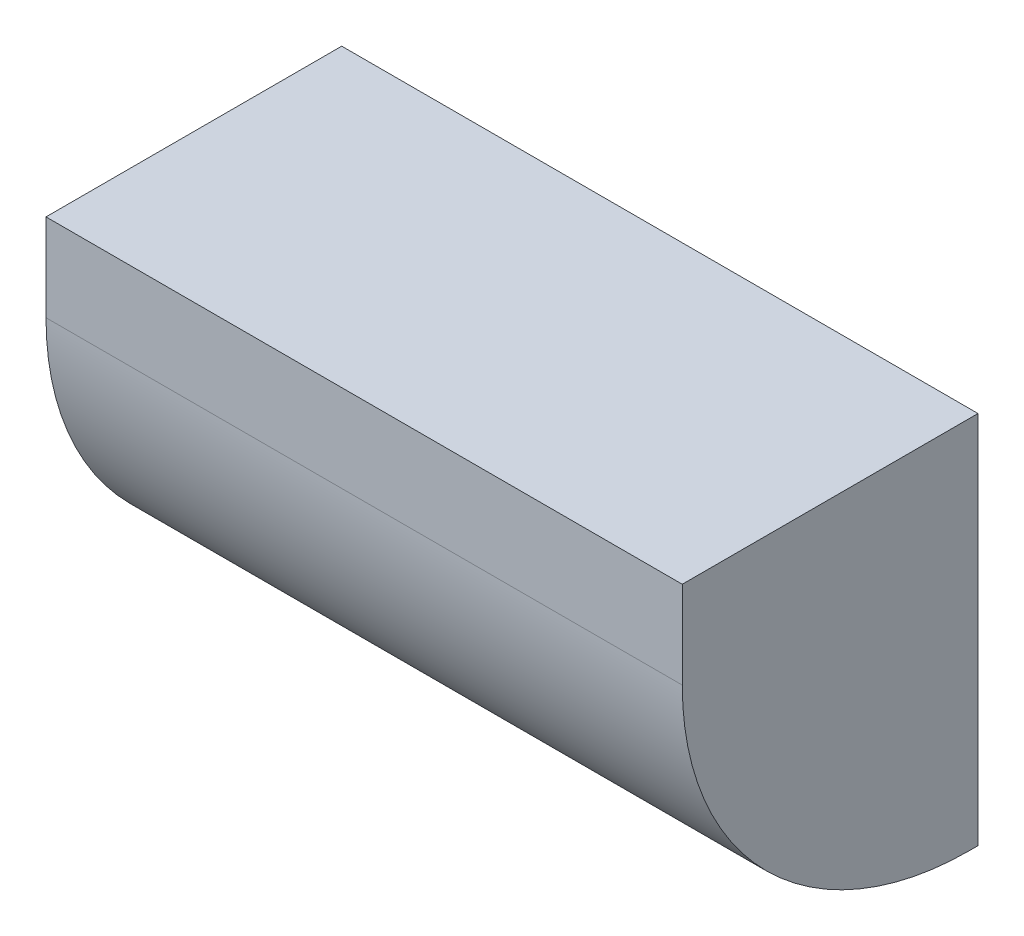
ISO-10303-21;
HEADER;
FILE_DESCRIPTION(('STEP AP214'),'2;1');
FILE_NAME('part.step','',(''),(''),'','','');
FILE_SCHEMA(('AUTOMOTIVE_DESIGN { 1 0 10303 214 1 1 1 1 }'));
ENDSEC;
DATA;
#1=APPLICATION_CONTEXT('core data for automotive mechanical design processes');
#2=APPLICATION_PROTOCOL_DEFINITION('international standard','automotive_design',2000,#1);
#3=PRODUCT_CONTEXT('',#1,'mechanical');
#4=PRODUCT('Part','Part','',(#3));
#5=PRODUCT_RELATED_PRODUCT_CATEGORY('part','',(#4));
#6=PRODUCT_DEFINITION_FORMATION('','',#4);
#7=PRODUCT_DEFINITION_CONTEXT('part definition',#1,'design');
#8=PRODUCT_DEFINITION('design','',#6,#7);
#9=PRODUCT_DEFINITION_SHAPE('','',#8);
#10=(LENGTH_UNIT() NAMED_UNIT(*) SI_UNIT(.MILLI.,.METRE.));
#11=(NAMED_UNIT(*) PLANE_ANGLE_UNIT() SI_UNIT($,.RADIAN.));
#12=(NAMED_UNIT(*) SI_UNIT($,.STERADIAN.) SOLID_ANGLE_UNIT());
#13=UNCERTAINTY_MEASURE_WITH_UNIT(LENGTH_MEASURE(1.E-05),#10,'distance_accuracy_value','');
#14=(GEOMETRIC_REPRESENTATION_CONTEXT(3) GLOBAL_UNCERTAINTY_ASSIGNED_CONTEXT((#13)) GLOBAL_UNIT_ASSIGNED_CONTEXT((#10,
#11,#12)) REPRESENTATION_CONTEXT('',''));
#15=CARTESIAN_POINT('',(0.,0.,0.));
#16=DIRECTION('',(0.,0.,1.));
#17=DIRECTION('',(1.,0.,0.));
#18=AXIS2_PLACEMENT_3D('',#15,#16,#17);
#19=CARTESIAN_POINT('',(0.,62.8959813156576,105.442125645559));
#20=DIRECTION('',(1.,0.,0.));
#21=DIRECTION('',(0.,0.,-1.));
#22=AXIS2_PLACEMENT_3D('',#19,#20,#21);
#23=CYLINDRICAL_SURFACE('',#22,23.);
#24=DIRECTION('',(-1.,0.,0.));
#25=VECTOR('',#24,1.);
#26=CARTESIAN_POINT('',(0.,39.8959813156576,105.442125645559));
#27=LINE('',#26,#25);
#28=CARTESIAN_POINT('',(280.,39.8959813156576,105.442125645559));
#29=VERTEX_POINT('',#28);
#30=CARTESIAN_POINT('',(229.,39.8959813156576,105.442125645559));
#31=VERTEX_POINT('',#30);
#32=EDGE_CURVE('E86',#29,#31,#27,.T.);
#33=ORIENTED_EDGE('',*,*,#32,.F.);
#34=CARTESIAN_POINT('',(280.,62.8959813156576,105.442125645559));
#35=DIRECTION('',(-1.,0.,0.));
#36=DIRECTION('',(0.,0.,1.));
#37=AXIS2_PLACEMENT_3D('',#34,#35,#36);
#38=CIRCLE('',#37,23.);
#39=CARTESIAN_POINT('',(280.,62.8959813156576,128.442125645559));
#40=VERTEX_POINT('',#39);
#41=EDGE_CURVE('E45',#40,#29,#38,.F.);
#42=ORIENTED_EDGE('',*,*,#41,.F.);
#43=DIRECTION('',(-1.,0.,0.));
#44=VECTOR('',#43,1.);
#45=CARTESIAN_POINT('',(0.,62.8959813156576,128.442125645559));
#46=LINE('',#45,#44);
#47=CARTESIAN_POINT('',(229.,62.8959813156576,128.442125645559));
#48=VERTEX_POINT('',#47);
#49=EDGE_CURVE('E115',#48,#40,#46,.F.);
#50=ORIENTED_EDGE('',*,*,#49,.F.);
#51=CARTESIAN_POINT('',(229.,62.8959813156576,105.442125645559));
#52=DIRECTION('',(1.,0.,0.));
#53=DIRECTION('',(0.,0.,-1.));
#54=AXIS2_PLACEMENT_3D('',#51,#52,#53);
#55=CIRCLE('',#54,23.);
#56=EDGE_CURVE('E11',#31,#48,#55,.F.);
#57=ORIENTED_EDGE('',*,*,#56,.F.);
#58=EDGE_LOOP('',(#33,#42,#50,#57));
#59=FACE_BOUND('',#58,.T.);
#60=ADVANCED_FACE('F38',(#59),#23,.T.);
#61=CARTESIAN_POINT('',(229.,-16.3431848396095,128.442125645559));
#62=DIRECTION('',(1.,0.,0.));
#63=DIRECTION('',(0.,0.,-1.));
#64=AXIS2_PLACEMENT_3D('',#61,#62,#63);
#65=PLANE('',#64);
#66=DIRECTION('',(0.,0.,-1.));
#67=VECTOR('',#66,1.);
#68=CARTESIAN_POINT('',(229.,39.8959813156576,128.442125645559));
#69=LINE('',#68,#67);
#70=CARTESIAN_POINT('',(229.,39.8959813156576,104.738880934344));
#71=VERTEX_POINT('',#70);
#72=EDGE_CURVE('E81',#31,#71,#69,.T.);
#73=ORIENTED_EDGE('',*,*,#72,.F.);
#74=ORIENTED_EDGE('',*,*,#56,.T.);
#75=DIRECTION('',(0.,1.,0.));
#76=VECTOR('',#75,1.);
#77=CARTESIAN_POINT('',(229.,-16.3431848396095,128.442125645559));
#78=LINE('',#77,#76);
#79=CARTESIAN_POINT('',(229.,69.8959813156576,128.442125645559));
#80=VERTEX_POINT('',#79);
#81=EDGE_CURVE('E106',#48,#80,#78,.T.);
#82=ORIENTED_EDGE('',*,*,#81,.T.);
#83=DIRECTION('',(0.,0.,-1.));
#84=VECTOR('',#83,1.);
#85=CARTESIAN_POINT('',(229.,69.8959813156576,128.442125645559));
#86=LINE('',#85,#84);
#87=CARTESIAN_POINT('',(229.,69.8959813156576,104.738880934344));
#88=VERTEX_POINT('',#87);
#89=EDGE_CURVE('E102',#80,#88,#86,.T.);
#90=ORIENTED_EDGE('',*,*,#89,.T.);
#91=DIRECTION('',(0.,1.,0.));
#92=VECTOR('',#91,1.);
#93=CARTESIAN_POINT('',(229.,-16.3431848396095,104.738880934344));
#94=LINE('',#93,#92);
#95=EDGE_CURVE('E94',#71,#88,#94,.T.);
#96=ORIENTED_EDGE('',*,*,#95,.F.);
#97=EDGE_LOOP('',(#73,#74,#82,#90,#96));
#98=FACE_BOUND('',#97,.T.);
#99=ADVANCED_FACE('F100',(#98),#65,.F.);
#100=CARTESIAN_POINT('',(229.,-16.3431848396095,104.738880934344));
#101=DIRECTION('',(0.,0.,1.));
#102=DIRECTION('',(1.,0.,0.));
#103=AXIS2_PLACEMENT_3D('',#100,#101,#102);
#104=PLANE('',#103);
#105=DIRECTION('',(1.,0.,0.));
#106=VECTOR('',#105,1.);
#107=CARTESIAN_POINT('',(229.,39.8959813156576,104.738880934344));
#108=LINE('',#107,#106);
#109=CARTESIAN_POINT('',(280.,39.8959813156576,104.738880934344));
#110=VERTEX_POINT('',#109);
#111=EDGE_CURVE('E85',#71,#110,#108,.T.);
#112=ORIENTED_EDGE('',*,*,#111,.F.);
#113=ORIENTED_EDGE('',*,*,#95,.T.);
#114=DIRECTION('',(1.,0.,0.));
#115=VECTOR('',#114,1.);
#116=CARTESIAN_POINT('',(229.,69.8959813156576,104.738880934344));
#117=LINE('',#116,#115);
#118=CARTESIAN_POINT('',(280.,69.8959813156576,104.738880934344));
#119=VERTEX_POINT('',#118);
#120=EDGE_CURVE('E103',#88,#119,#117,.T.);
#121=ORIENTED_EDGE('',*,*,#120,.T.);
#122=DIRECTION('',(0.,1.,0.));
#123=VECTOR('',#122,1.);
#124=CARTESIAN_POINT('',(280.,-16.3431848396095,104.738880934344));
#125=LINE('',#124,#123);
#126=EDGE_CURVE('E96',#110,#119,#125,.T.);
#127=ORIENTED_EDGE('',*,*,#126,.F.);
#128=EDGE_LOOP('',(#112,#113,#121,#127));
#129=FACE_BOUND('',#128,.T.);
#130=ADVANCED_FACE('F92',(#129),#104,.F.);
#131=CARTESIAN_POINT('',(280.,-16.3431848396095,128.442125645559));
#132=DIRECTION('',(-1.,0.,0.));
#133=DIRECTION('',(0.,0.,1.));
#134=AXIS2_PLACEMENT_3D('',#131,#132,#133);
#135=PLANE('',#134);
#136=DIRECTION('',(0.,1.,0.));
#137=VECTOR('',#136,1.);
#138=CARTESIAN_POINT('',(280.,-16.3431848396095,128.442125645559));
#139=LINE('',#138,#137);
#140=CARTESIAN_POINT('',(280.,69.8959813156576,128.442125645559));
#141=VERTEX_POINT('',#140);
#142=EDGE_CURVE('E111',#40,#141,#139,.T.);
#143=ORIENTED_EDGE('',*,*,#142,.F.);
#144=ORIENTED_EDGE('',*,*,#41,.T.);
#145=DIRECTION('',(0.,0.,1.));
#146=VECTOR('',#145,1.);
#147=CARTESIAN_POINT('',(280.,39.8959813156576,128.442125645559));
#148=LINE('',#147,#146);
#149=EDGE_CURVE('E97',#110,#29,#148,.T.);
#150=ORIENTED_EDGE('',*,*,#149,.F.);
#151=ORIENTED_EDGE('',*,*,#126,.T.);
#152=DIRECTION('',(0.,0.,1.));
#153=VECTOR('',#152,1.);
#154=CARTESIAN_POINT('',(280.,69.8959813156576,128.442125645559));
#155=LINE('',#154,#153);
#156=EDGE_CURVE('E110',#119,#141,#155,.T.);
#157=ORIENTED_EDGE('',*,*,#156,.T.);
#158=EDGE_LOOP('',(#143,#144,#150,#151,#157));
#159=FACE_BOUND('',#158,.T.);
#160=ADVANCED_FACE('F118',(#159),#135,.F.);
#161=CARTESIAN_POINT('',(229.,-16.3431848396095,128.442125645559));
#162=DIRECTION('',(0.,0.,-1.));
#163=DIRECTION('',(-1.,0.,0.));
#164=AXIS2_PLACEMENT_3D('',#161,#162,#163);
#165=PLANE('',#164);
#166=ORIENTED_EDGE('',*,*,#81,.F.);
#167=ORIENTED_EDGE('',*,*,#49,.T.);
#168=ORIENTED_EDGE('',*,*,#142,.T.);
#169=DIRECTION('',(-1.,0.,0.));
#170=VECTOR('',#169,1.);
#171=CARTESIAN_POINT('',(229.,69.8959813156576,128.442125645559));
#172=LINE('',#171,#170);
#173=EDGE_CURVE('E88',#141,#80,#172,.T.);
#174=ORIENTED_EDGE('',*,*,#173,.T.);
#175=EDGE_LOOP('',(#166,#167,#168,#174));
#176=FACE_BOUND('',#175,.T.);
#177=ADVANCED_FACE('F127',(#176),#165,.F.);
#178=CARTESIAN_POINT('',(0.,69.8959813156576,0.));
#179=DIRECTION('',(0.,-1.,0.));
#180=DIRECTION('',(0.,0.,-1.));
#181=AXIS2_PLACEMENT_3D('',#178,#179,#180);
#182=PLANE('',#181);
#183=ORIENTED_EDGE('',*,*,#89,.F.);
#184=ORIENTED_EDGE('',*,*,#173,.F.);
#185=ORIENTED_EDGE('',*,*,#156,.F.);
#186=ORIENTED_EDGE('',*,*,#120,.F.);
#187=EDGE_LOOP('',(#183,#184,#185,#186));
#188=FACE_BOUND('',#187,.T.);
#189=ADVANCED_FACE('F130',(#188),#182,.F.);
#190=CARTESIAN_POINT('',(0.,39.8959813156576,0.));
#191=DIRECTION('',(0.,-1.,0.));
#192=DIRECTION('',(0.,0.,-1.));
#193=AXIS2_PLACEMENT_3D('',#190,#191,#192);
#194=PLANE('',#193);
#195=ORIENTED_EDGE('',*,*,#149,.T.);
#196=ORIENTED_EDGE('',*,*,#32,.T.);
#197=ORIENTED_EDGE('',*,*,#72,.T.);
#198=ORIENTED_EDGE('',*,*,#111,.T.);
#199=EDGE_LOOP('',(#195,#196,#197,#198));
#200=FACE_BOUND('',#199,.T.);
#201=ADVANCED_FACE('F84',(#200),#194,.T.);
#202=CLOSED_SHELL('',(#60,#99,#130,#160,#177,#189,#201));
#203=MANIFOLD_SOLID_BREP('B2',#202);
#204=ADVANCED_BREP_SHAPE_REPRESENTATION('',(#18,#203),#14);
#205=SHAPE_DEFINITION_REPRESENTATION(#9,#204);
ENDSEC;
END-ISO-10303-21;
